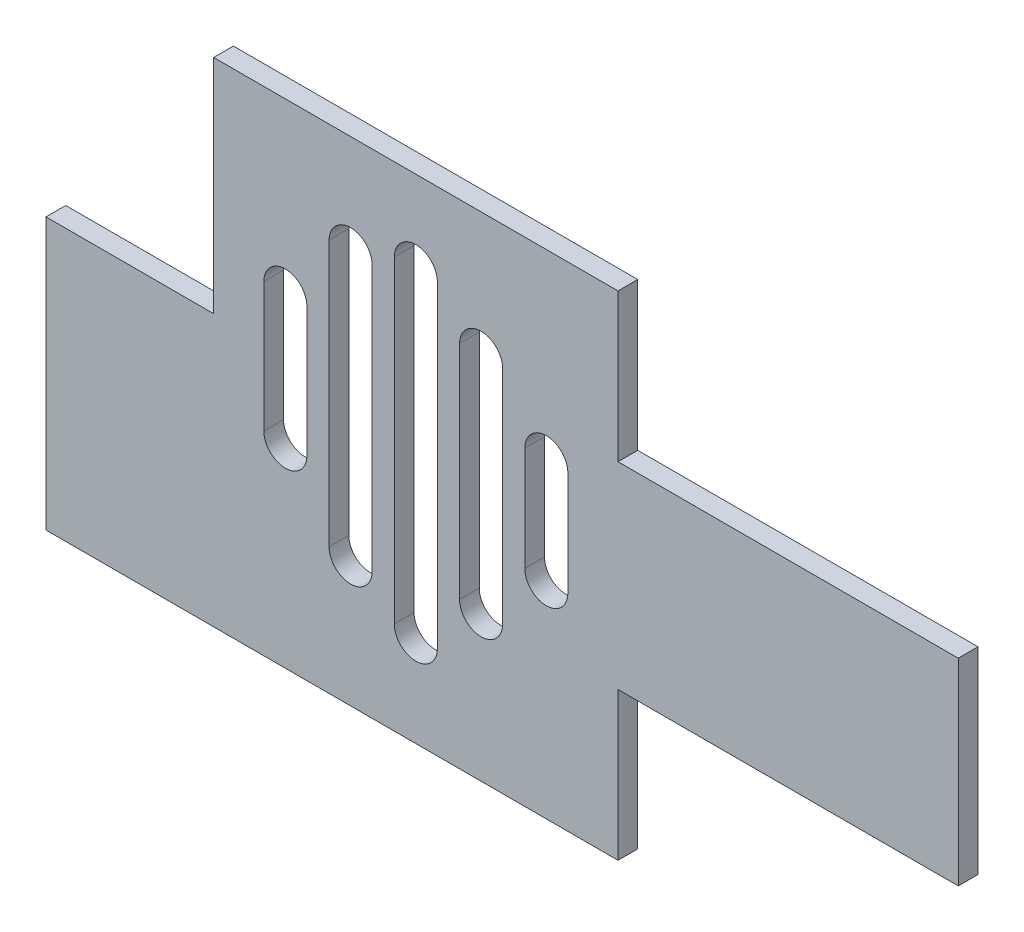
ISO-10303-21;
HEADER;
FILE_DESCRIPTION(('STEP AP214'),'2;1');
FILE_NAME('part.step','',(''),(''),'','','');
FILE_SCHEMA(('AUTOMOTIVE_DESIGN { 1 0 10303 214 1 1 1 1 }'));
ENDSEC;
DATA;
#1=APPLICATION_CONTEXT('core data for automotive mechanical design processes');
#2=APPLICATION_PROTOCOL_DEFINITION('international standard','automotive_design',2000,#1);
#3=PRODUCT_CONTEXT('',#1,'mechanical');
#4=PRODUCT('Part','Part','',(#3));
#5=PRODUCT_RELATED_PRODUCT_CATEGORY('part','',(#4));
#6=PRODUCT_DEFINITION_FORMATION('','',#4);
#7=PRODUCT_DEFINITION_CONTEXT('part definition',#1,'design');
#8=PRODUCT_DEFINITION('design','',#6,#7);
#9=PRODUCT_DEFINITION_SHAPE('','',#8);
#10=(LENGTH_UNIT() NAMED_UNIT(*) SI_UNIT(.MILLI.,.METRE.));
#11=(NAMED_UNIT(*) PLANE_ANGLE_UNIT() SI_UNIT($,.RADIAN.));
#12=(NAMED_UNIT(*) SI_UNIT($,.STERADIAN.) SOLID_ANGLE_UNIT());
#13=UNCERTAINTY_MEASURE_WITH_UNIT(LENGTH_MEASURE(1.E-05),#10,'distance_accuracy_value','');
#14=(GEOMETRIC_REPRESENTATION_CONTEXT(3) GLOBAL_UNCERTAINTY_ASSIGNED_CONTEXT((#13)) GLOBAL_UNIT_ASSIGNED_CONTEXT((#10,
#11,#12)) REPRESENTATION_CONTEXT('',''));
#15=CARTESIAN_POINT('',(0.,0.,0.));
#16=DIRECTION('',(0.,0.,1.));
#17=DIRECTION('',(1.,0.,0.));
#18=AXIS2_PLACEMENT_3D('',#15,#16,#17);
#19=CARTESIAN_POINT('',(0.,0.,4.));
#20=DIRECTION('',(0.,0.,1.));
#21=DIRECTION('',(1.,0.,0.));
#22=AXIS2_PLACEMENT_3D('',#19,#20,#21);
#23=PLANE('',#22);
#24=DIRECTION('',(1.,0.,0.));
#25=VECTOR('',#24,1.);
#26=CARTESIAN_POINT('',(41.,-50.,4.));
#27=LINE('',#26,#25);
#28=CARTESIAN_POINT('',(-75.,-50.,4.));
#29=VERTEX_POINT('',#28);
#30=CARTESIAN_POINT('',(41.,-50.,4.));
#31=VERTEX_POINT('',#30);
#32=EDGE_CURVE('E390',#29,#31,#27,.T.);
#33=ORIENTED_EDGE('',*,*,#32,.T.);
#34=DIRECTION('',(0.,1.,0.));
#35=VECTOR('',#34,1.);
#36=CARTESIAN_POINT('',(41.,-20.,4.));
#37=LINE('',#36,#35);
#38=CARTESIAN_POINT('',(41.,-20.,4.));
#39=VERTEX_POINT('',#38);
#40=EDGE_CURVE('E393',#31,#39,#37,.T.);
#41=ORIENTED_EDGE('',*,*,#40,.T.);
#42=DIRECTION('',(1.,0.,0.));
#43=VECTOR('',#42,1.);
#44=CARTESIAN_POINT('',(110.,-20.,4.));
#45=LINE('',#44,#43);
#46=CARTESIAN_POINT('',(110.,-20.,4.));
#47=VERTEX_POINT('',#46);
#48=EDGE_CURVE('E396',#39,#47,#45,.T.);
#49=ORIENTED_EDGE('',*,*,#48,.T.);
#50=DIRECTION('',(0.,1.,0.));
#51=VECTOR('',#50,1.);
#52=CARTESIAN_POINT('',(110.,20.,4.));
#53=LINE('',#52,#51);
#54=CARTESIAN_POINT('',(110.,20.,4.));
#55=VERTEX_POINT('',#54);
#56=EDGE_CURVE('E398',#47,#55,#53,.T.);
#57=ORIENTED_EDGE('',*,*,#56,.T.);
#58=DIRECTION('',(-1.,0.,0.));
#59=VECTOR('',#58,1.);
#60=CARTESIAN_POINT('',(41.,20.,4.));
#61=LINE('',#60,#59);
#62=CARTESIAN_POINT('',(41.,20.,4.));
#63=VERTEX_POINT('',#62);
#64=EDGE_CURVE('E400',#55,#63,#61,.T.);
#65=ORIENTED_EDGE('',*,*,#64,.T.);
#66=DIRECTION('',(0.,1.,0.));
#67=VECTOR('',#66,1.);
#68=CARTESIAN_POINT('',(41.,50.,4.));
#69=LINE('',#68,#67);
#70=CARTESIAN_POINT('',(41.,50.,4.));
#71=VERTEX_POINT('',#70);
#72=EDGE_CURVE('E402',#63,#71,#69,.T.);
#73=ORIENTED_EDGE('',*,*,#72,.T.);
#74=DIRECTION('',(-1.,0.,0.));
#75=VECTOR('',#74,1.);
#76=CARTESIAN_POINT('',(41.,50.,4.));
#77=LINE('',#76,#75);
#78=CARTESIAN_POINT('',(-41.,50.,4.));
#79=VERTEX_POINT('',#78);
#80=EDGE_CURVE('E404',#71,#79,#77,.T.);
#81=ORIENTED_EDGE('',*,*,#80,.T.);
#82=DIRECTION('',(0.,-1.,0.));
#83=VECTOR('',#82,1.);
#84=CARTESIAN_POINT('',(-41.,50.,4.));
#85=LINE('',#84,#83);
#86=CARTESIAN_POINT('',(-41.,4.99999999999999,4.));
#87=VERTEX_POINT('',#86);
#88=EDGE_CURVE('E406',#79,#87,#85,.T.);
#89=ORIENTED_EDGE('',*,*,#88,.T.);
#90=DIRECTION('',(-1.,0.,0.));
#91=VECTOR('',#90,1.);
#92=CARTESIAN_POINT('',(-41.,4.99999999999999,4.));
#93=LINE('',#92,#91);
#94=CARTESIAN_POINT('',(-75.,4.99999999999998,4.));
#95=VERTEX_POINT('',#94);
#96=EDGE_CURVE('E408',#87,#95,#93,.T.);
#97=ORIENTED_EDGE('',*,*,#96,.T.);
#98=DIRECTION('',(0.,-1.,0.));
#99=VECTOR('',#98,1.);
#100=CARTESIAN_POINT('',(-75.,4.99999999999998,4.));
#101=LINE('',#100,#99);
#102=EDGE_CURVE('E410',#95,#29,#101,.T.);
#103=ORIENTED_EDGE('',*,*,#102,.T.);
#104=EDGE_LOOP('',(#33,#41,#49,#57,#65,#73,#81,#89,#97,#103));
#105=FACE_BOUND('',#104,.T.);
#106=DIRECTION('',(0.,-1.,0.));
#107=VECTOR('',#106,1.);
#108=CARTESIAN_POINT('',(-4.36484114330157,33.2683363309352,4.));
#109=LINE('',#108,#107);
#110=CARTESIAN_POINT('',(-4.36484114330157,33.2683363309352,4.));
#111=VERTEX_POINT('',#110);
#112=CARTESIAN_POINT('',(-4.36484114330157,-31.1611600719424,4.));
#113=VERTEX_POINT('',#112);
#114=EDGE_CURVE('E361',#111,#113,#109,.T.);
#115=ORIENTED_EDGE('',*,*,#114,.F.);
#116=CARTESIAN_POINT('',(0.,33.2683363309352,4.));
#117=DIRECTION('',(0.,0.,1.));
#118=DIRECTION('',(1.,0.,0.));
#119=AXIS2_PLACEMENT_3D('',#116,#117,#118);
#120=CIRCLE('',#119,4.36484114330157);
#121=CARTESIAN_POINT('',(4.36484114330157,33.2683363309352,4.));
#122=VERTEX_POINT('',#121);
#123=EDGE_CURVE('E359',#122,#111,#120,.T.);
#124=ORIENTED_EDGE('',*,*,#123,.F.);
#125=DIRECTION('',(0.,1.,0.));
#126=VECTOR('',#125,1.);
#127=CARTESIAN_POINT('',(4.36484114330157,33.2683363309352,4.));
#128=LINE('',#127,#126);
#129=CARTESIAN_POINT('',(4.36484114330157,-31.1611600719424,4.));
#130=VERTEX_POINT('',#129);
#131=EDGE_CURVE('E367',#130,#122,#128,.T.);
#132=ORIENTED_EDGE('',*,*,#131,.F.);
#133=CARTESIAN_POINT('',(0.,-31.1611600719424,4.));
#134=DIRECTION('',(0.,0.,1.));
#135=DIRECTION('',(1.,0.,0.));
#136=AXIS2_PLACEMENT_3D('',#133,#134,#135);
#137=CIRCLE('',#136,4.36484114330157);
#138=EDGE_CURVE('E364',#113,#130,#137,.T.);
#139=ORIENTED_EDGE('',*,*,#138,.F.);
#140=EDGE_LOOP('',(#115,#124,#132,#139));
#141=FACE_BOUND('',#140,.T.);
#142=DIRECTION('',(0.,-1.,0.));
#143=VECTOR('',#142,1.);
#144=CARTESIAN_POINT('',(-17.5945234233016,29.6338519184652,4.));
#145=LINE('',#144,#143);
#146=CARTESIAN_POINT('',(-17.5945234233016,29.6338519184652,4.));
#147=VERTEX_POINT('',#146);
#148=CARTESIAN_POINT('',(-17.5945234233016,-24.2225989208633,4.));
#149=VERTEX_POINT('',#148);
#150=EDGE_CURVE('E330',#147,#149,#145,.T.);
#151=ORIENTED_EDGE('',*,*,#150,.F.);
#152=CARTESIAN_POINT('',(-13.2296822833016,29.6338519184652,4.));
#153=DIRECTION('',(0.,0.,1.));
#154=DIRECTION('',(1.,0.,0.));
#155=AXIS2_PLACEMENT_3D('',#152,#153,#154);
#156=CIRCLE('',#155,4.36484114);
#157=CARTESIAN_POINT('',(-8.86484114330157,29.6338519184652,4.));
#158=VERTEX_POINT('',#157);
#159=EDGE_CURVE('E328',#158,#147,#156,.T.);
#160=ORIENTED_EDGE('',*,*,#159,.F.);
#161=DIRECTION('',(0.,1.,0.));
#162=VECTOR('',#161,1.);
#163=CARTESIAN_POINT('',(-8.86484114330157,29.6338519184652,4.));
#164=LINE('',#163,#162);
#165=CARTESIAN_POINT('',(-8.86484114330157,-24.2225989208633,4.));
#166=VERTEX_POINT('',#165);
#167=EDGE_CURVE('E336',#166,#158,#164,.T.);
#168=ORIENTED_EDGE('',*,*,#167,.F.);
#169=CARTESIAN_POINT('',(-13.2296822833016,-24.2225989208633,4.));
#170=DIRECTION('',(0.,0.,1.));
#171=DIRECTION('',(1.,0.,0.));
#172=AXIS2_PLACEMENT_3D('',#169,#170,#171);
#173=CIRCLE('',#172,4.36484114);
#174=EDGE_CURVE('E333',#149,#166,#173,.T.);
#175=ORIENTED_EDGE('',*,*,#174,.F.);
#176=EDGE_LOOP('',(#151,#160,#168,#175));
#177=FACE_BOUND('',#176,.T.);
#178=DIRECTION('',(0.,-1.,0.));
#179=VECTOR('',#178,1.);
#180=CARTESIAN_POINT('',(8.86484114330157,24.6777368105516,4.));
#181=LINE('',#180,#179);
#182=CARTESIAN_POINT('',(8.86484114330157,24.6777368105516,4.));
#183=VERTEX_POINT('',#182);
#184=CARTESIAN_POINT('',(8.86484114330157,-20.2577068345324,4.));
#185=VERTEX_POINT('',#184);
#186=EDGE_CURVE('E299',#183,#185,#181,.T.);
#187=ORIENTED_EDGE('',*,*,#186,.F.);
#188=CARTESIAN_POINT('',(13.2296822833016,24.6777368105516,4.));
#189=DIRECTION('',(0.,0.,1.));
#190=DIRECTION('',(1.,0.,0.));
#191=AXIS2_PLACEMENT_3D('',#188,#189,#190);
#192=CIRCLE('',#191,4.36484114);
#193=CARTESIAN_POINT('',(17.5945234233016,24.6777368105516,4.));
#194=VERTEX_POINT('',#193);
#195=EDGE_CURVE('E297',#194,#183,#192,.T.);
#196=ORIENTED_EDGE('',*,*,#195,.F.);
#197=DIRECTION('',(0.,1.,0.));
#198=VECTOR('',#197,1.);
#199=CARTESIAN_POINT('',(17.5945234233016,24.6777368105516,4.));
#200=LINE('',#199,#198);
#201=CARTESIAN_POINT('',(17.5945234233016,-20.2577068345324,4.));
#202=VERTEX_POINT('',#201);
#203=EDGE_CURVE('E305',#202,#194,#200,.T.);
#204=ORIENTED_EDGE('',*,*,#203,.F.);
#205=CARTESIAN_POINT('',(13.2296822833016,-20.2577068345324,4.));
#206=DIRECTION('',(0.,0.,1.));
#207=DIRECTION('',(1.,0.,0.));
#208=AXIS2_PLACEMENT_3D('',#205,#206,#207);
#209=CIRCLE('',#208,4.36484114);
#210=EDGE_CURVE('E302',#185,#202,#209,.T.);
#211=ORIENTED_EDGE('',*,*,#210,.F.);
#212=EDGE_LOOP('',(#187,#196,#204,#211));
#213=FACE_BOUND('',#212,.T.);
#214=DIRECTION('',(0.,-1.,0.));
#215=VECTOR('',#214,1.);
#216=CARTESIAN_POINT('',(-30.8242057033016,15.756729616307,4.));
#217=LINE('',#216,#215);
#218=CARTESIAN_POINT('',(-30.8242057033016,15.756729616307,4.));
#219=VERTEX_POINT('',#218);
#220=CARTESIAN_POINT('',(-30.8242057033016,-10.5106804556355,4.));
#221=VERTEX_POINT('',#220);
#222=EDGE_CURVE('E268',#219,#221,#217,.T.);
#223=ORIENTED_EDGE('',*,*,#222,.F.);
#224=CARTESIAN_POINT('',(-26.4593645633016,15.756729616307,4.));
#225=DIRECTION('',(0.,0.,1.));
#226=DIRECTION('',(1.,0.,0.));
#227=AXIS2_PLACEMENT_3D('',#224,#225,#226);
#228=CIRCLE('',#227,4.36484114);
#229=CARTESIAN_POINT('',(-22.0945234233016,15.756729616307,4.));
#230=VERTEX_POINT('',#229);
#231=EDGE_CURVE('E266',#230,#219,#228,.T.);
#232=ORIENTED_EDGE('',*,*,#231,.F.);
#233=DIRECTION('',(0.,1.,0.));
#234=VECTOR('',#233,1.);
#235=CARTESIAN_POINT('',(-22.0945234233016,15.756729616307,4.));
#236=LINE('',#235,#234);
#237=CARTESIAN_POINT('',(-22.0945234233016,-10.5106804556355,4.));
#238=VERTEX_POINT('',#237);
#239=EDGE_CURVE('E274',#238,#230,#236,.T.);
#240=ORIENTED_EDGE('',*,*,#239,.F.);
#241=CARTESIAN_POINT('',(-26.4593645633016,-10.5106804556355,4.));
#242=DIRECTION('',(0.,0.,1.));
#243=DIRECTION('',(1.,0.,0.));
#244=AXIS2_PLACEMENT_3D('',#241,#242,#243);
#245=CIRCLE('',#244,4.36484114);
#246=EDGE_CURVE('E271',#221,#238,#245,.T.);
#247=ORIENTED_EDGE('',*,*,#246,.F.);
#248=EDGE_LOOP('',(#223,#232,#240,#247));
#249=FACE_BOUND('',#248,.T.);
#250=DIRECTION('',(0.,-1.,0.));
#251=VECTOR('',#250,1.);
#252=CARTESIAN_POINT('',(22.0945234233016,12.9482643884892,4.));
#253=LINE('',#252,#251);
#254=CARTESIAN_POINT('',(22.0945234233016,12.9482643884892,4.));
#255=VERTEX_POINT('',#254);
#256=CARTESIAN_POINT('',(22.0945234233016,-8.19782673860911,4.));
#257=VERTEX_POINT('',#256);
#258=EDGE_CURVE('E238',#255,#257,#253,.T.);
#259=ORIENTED_EDGE('',*,*,#258,.F.);
#260=CARTESIAN_POINT('',(26.4593645633016,12.9482643884892,4.));
#261=DIRECTION('',(0.,0.,1.));
#262=DIRECTION('',(1.,0.,0.));
#263=AXIS2_PLACEMENT_3D('',#260,#261,#262);
#264=CIRCLE('',#263,4.36484114);
#265=CARTESIAN_POINT('',(30.8242057033016,12.9482643884892,4.));
#266=VERTEX_POINT('',#265);
#267=EDGE_CURVE('E230',#266,#255,#264,.T.);
#268=ORIENTED_EDGE('',*,*,#267,.F.);
#269=DIRECTION('',(0.,1.,0.));
#270=VECTOR('',#269,1.);
#271=CARTESIAN_POINT('',(30.8242057033016,12.9482643884892,4.));
#272=LINE('',#271,#270);
#273=CARTESIAN_POINT('',(30.8242057033016,-8.19782673860911,4.));
#274=VERTEX_POINT('',#273);
#275=EDGE_CURVE('E252',#274,#266,#272,.T.);
#276=ORIENTED_EDGE('',*,*,#275,.F.);
#277=CARTESIAN_POINT('',(26.4593645633016,-8.19782673860911,4.));
#278=DIRECTION('',(0.,0.,1.));
#279=DIRECTION('',(1.,0.,0.));
#280=AXIS2_PLACEMENT_3D('',#277,#278,#279);
#281=CIRCLE('',#280,4.36484114);
#282=EDGE_CURVE('E250',#257,#274,#281,.T.);
#283=ORIENTED_EDGE('',*,*,#282,.F.);
#284=EDGE_LOOP('',(#259,#268,#276,#283));
#285=FACE_BOUND('',#284,.T.);
#286=ADVANCED_FACE('F33',(#105,#141,#177,#213,#249,#285),#23,.T.);
#287=CARTESIAN_POINT('',(0.,0.,0.));
#288=DIRECTION('',(0.,0.,1.));
#289=DIRECTION('',(1.,0.,0.));
#290=AXIS2_PLACEMENT_3D('',#287,#288,#289);
#291=PLANE('',#290);
#292=CARTESIAN_POINT('',(-26.4593645633016,15.756729616307,0.));
#293=DIRECTION('',(0.,0.,1.));
#294=DIRECTION('',(1.,0.,0.));
#295=AXIS2_PLACEMENT_3D('',#292,#293,#294);
#296=CIRCLE('',#295,4.36484114);
#297=CARTESIAN_POINT('',(-22.0945234233016,15.756729616307,0.));
#298=VERTEX_POINT('',#297);
#299=CARTESIAN_POINT('',(-30.8242057033016,15.756729616307,0.));
#300=VERTEX_POINT('',#299);
#301=EDGE_CURVE('E246',#298,#300,#296,.T.);
#302=ORIENTED_EDGE('',*,*,#301,.T.);
#303=DIRECTION('',(0.,-1.,0.));
#304=VECTOR('',#303,1.);
#305=CARTESIAN_POINT('',(-30.8242057033016,15.756729616307,0.));
#306=LINE('',#305,#304);
#307=CARTESIAN_POINT('',(-30.8242057033016,-10.5106804556355,0.));
#308=VERTEX_POINT('',#307);
#309=EDGE_CURVE('E279',#300,#308,#306,.T.);
#310=ORIENTED_EDGE('',*,*,#309,.T.);
#311=CARTESIAN_POINT('',(-26.4593645633016,-10.5106804556355,0.));
#312=DIRECTION('',(0.,0.,1.));
#313=DIRECTION('',(1.,0.,0.));
#314=AXIS2_PLACEMENT_3D('',#311,#312,#313);
#315=CIRCLE('',#314,4.36484114);
#316=CARTESIAN_POINT('',(-22.0945234233016,-10.5106804556355,0.));
#317=VERTEX_POINT('',#316);
#318=EDGE_CURVE('E282',#308,#317,#315,.T.);
#319=ORIENTED_EDGE('',*,*,#318,.T.);
#320=DIRECTION('',(0.,1.,0.));
#321=VECTOR('',#320,1.);
#322=CARTESIAN_POINT('',(-22.0945234233016,15.756729616307,0.));
#323=LINE('',#322,#321);
#324=EDGE_CURVE('E269',#317,#298,#323,.T.);
#325=ORIENTED_EDGE('',*,*,#324,.T.);
#326=EDGE_LOOP('',(#302,#310,#319,#325));
#327=FACE_BOUND('',#326,.T.);
#328=CARTESIAN_POINT('',(-13.2296822833016,29.6338519184652,0.));
#329=DIRECTION('',(0.,0.,1.));
#330=DIRECTION('',(1.,0.,0.));
#331=AXIS2_PLACEMENT_3D('',#328,#329,#330);
#332=CIRCLE('',#331,4.36484114);
#333=CARTESIAN_POINT('',(-8.86484114330157,29.6338519184652,0.));
#334=VERTEX_POINT('',#333);
#335=CARTESIAN_POINT('',(-17.5945234233016,29.6338519184652,0.));
#336=VERTEX_POINT('',#335);
#337=EDGE_CURVE('E327',#334,#336,#332,.T.);
#338=ORIENTED_EDGE('',*,*,#337,.T.);
#339=DIRECTION('',(0.,-1.,0.));
#340=VECTOR('',#339,1.);
#341=CARTESIAN_POINT('',(-17.5945234233016,29.6338519184652,0.));
#342=LINE('',#341,#340);
#343=CARTESIAN_POINT('',(-17.5945234233016,-24.2225989208633,0.));
#344=VERTEX_POINT('',#343);
#345=EDGE_CURVE('E341',#336,#344,#342,.T.);
#346=ORIENTED_EDGE('',*,*,#345,.T.);
#347=CARTESIAN_POINT('',(-13.2296822833016,-24.2225989208633,0.));
#348=DIRECTION('',(0.,0.,1.));
#349=DIRECTION('',(1.,0.,0.));
#350=AXIS2_PLACEMENT_3D('',#347,#348,#349);
#351=CIRCLE('',#350,4.36484114);
#352=CARTESIAN_POINT('',(-8.86484114330157,-24.2225989208633,0.));
#353=VERTEX_POINT('',#352);
#354=EDGE_CURVE('E344',#344,#353,#351,.T.);
#355=ORIENTED_EDGE('',*,*,#354,.T.);
#356=DIRECTION('',(0.,1.,0.));
#357=VECTOR('',#356,1.);
#358=CARTESIAN_POINT('',(-8.86484114330157,29.6338519184652,0.));
#359=LINE('',#358,#357);
#360=EDGE_CURVE('E331',#353,#334,#359,.T.);
#361=ORIENTED_EDGE('',*,*,#360,.T.);
#362=EDGE_LOOP('',(#338,#346,#355,#361));
#363=FACE_BOUND('',#362,.T.);
#364=DIRECTION('',(1.,0.,0.));
#365=VECTOR('',#364,1.);
#366=CARTESIAN_POINT('',(41.,-50.,0.));
#367=LINE('',#366,#365);
#368=CARTESIAN_POINT('',(-75.,-50.,0.));
#369=VERTEX_POINT('',#368);
#370=CARTESIAN_POINT('',(41.,-50.,0.));
#371=VERTEX_POINT('',#370);
#372=EDGE_CURVE('E389',#369,#371,#367,.T.);
#373=ORIENTED_EDGE('',*,*,#372,.F.);
#374=DIRECTION('',(0.,-1.,0.));
#375=VECTOR('',#374,1.);
#376=CARTESIAN_POINT('',(-75.,4.99999999999998,0.));
#377=LINE('',#376,#375);
#378=CARTESIAN_POINT('',(-75.,4.99999999999998,0.));
#379=VERTEX_POINT('',#378);
#380=EDGE_CURVE('E394',#379,#369,#377,.T.);
#381=ORIENTED_EDGE('',*,*,#380,.F.);
#382=DIRECTION('',(-1.,0.,0.));
#383=VECTOR('',#382,1.);
#384=CARTESIAN_POINT('',(-41.,4.99999999999999,0.));
#385=LINE('',#384,#383);
#386=CARTESIAN_POINT('',(-41.,4.99999999999999,0.));
#387=VERTEX_POINT('',#386);
#388=EDGE_CURVE('E429',#387,#379,#385,.T.);
#389=ORIENTED_EDGE('',*,*,#388,.F.);
#390=DIRECTION('',(0.,-1.,0.));
#391=VECTOR('',#390,1.);
#392=CARTESIAN_POINT('',(-41.,50.,0.));
#393=LINE('',#392,#391);
#394=CARTESIAN_POINT('',(-41.,50.,0.));
#395=VERTEX_POINT('',#394);
#396=EDGE_CURVE('E427',#395,#387,#393,.T.);
#397=ORIENTED_EDGE('',*,*,#396,.F.);
#398=DIRECTION('',(-1.,0.,0.));
#399=VECTOR('',#398,1.);
#400=CARTESIAN_POINT('',(41.,50.,0.));
#401=LINE('',#400,#399);
#402=CARTESIAN_POINT('',(41.,50.,0.));
#403=VERTEX_POINT('',#402);
#404=EDGE_CURVE('E425',#403,#395,#401,.T.);
#405=ORIENTED_EDGE('',*,*,#404,.F.);
#406=DIRECTION('',(0.,1.,0.));
#407=VECTOR('',#406,1.);
#408=CARTESIAN_POINT('',(41.,50.,0.));
#409=LINE('',#408,#407);
#410=CARTESIAN_POINT('',(41.,20.,0.));
#411=VERTEX_POINT('',#410);
#412=EDGE_CURVE('E423',#411,#403,#409,.T.);
#413=ORIENTED_EDGE('',*,*,#412,.F.);
#414=DIRECTION('',(-1.,0.,0.));
#415=VECTOR('',#414,1.);
#416=CARTESIAN_POINT('',(41.,20.,0.));
#417=LINE('',#416,#415);
#418=CARTESIAN_POINT('',(110.,20.,0.));
#419=VERTEX_POINT('',#418);
#420=EDGE_CURVE('E421',#419,#411,#417,.T.);
#421=ORIENTED_EDGE('',*,*,#420,.F.);
#422=DIRECTION('',(0.,1.,0.));
#423=VECTOR('',#422,1.);
#424=CARTESIAN_POINT('',(110.,20.,0.));
#425=LINE('',#424,#423);
#426=CARTESIAN_POINT('',(110.,-20.,0.));
#427=VERTEX_POINT('',#426);
#428=EDGE_CURVE('E419',#427,#419,#425,.T.);
#429=ORIENTED_EDGE('',*,*,#428,.F.);
#430=DIRECTION('',(1.,0.,0.));
#431=VECTOR('',#430,1.);
#432=CARTESIAN_POINT('',(110.,-20.,0.));
#433=LINE('',#432,#431);
#434=CARTESIAN_POINT('',(41.,-20.,0.));
#435=VERTEX_POINT('',#434);
#436=EDGE_CURVE('E417',#435,#427,#433,.T.);
#437=ORIENTED_EDGE('',*,*,#436,.F.);
#438=DIRECTION('',(0.,1.,0.));
#439=VECTOR('',#438,1.);
#440=CARTESIAN_POINT('',(41.,-20.,0.));
#441=LINE('',#440,#439);
#442=EDGE_CURVE('E415',#371,#435,#441,.T.);
#443=ORIENTED_EDGE('',*,*,#442,.F.);
#444=EDGE_LOOP('',(#373,#381,#389,#397,#405,#413,#421,#429,#437,#443));
#445=FACE_BOUND('',#444,.T.);
#446=CARTESIAN_POINT('',(0.,33.2683363309352,0.));
#447=DIRECTION('',(0.,0.,1.));
#448=DIRECTION('',(1.,0.,0.));
#449=AXIS2_PLACEMENT_3D('',#446,#447,#448);
#450=CIRCLE('',#449,4.36484114330157);
#451=CARTESIAN_POINT('',(4.36484114330157,33.2683363309352,0.));
#452=VERTEX_POINT('',#451);
#453=CARTESIAN_POINT('',(-4.36484114330157,33.2683363309352,0.));
#454=VERTEX_POINT('',#453);
#455=EDGE_CURVE('E358',#452,#454,#450,.T.);
#456=ORIENTED_EDGE('',*,*,#455,.T.);
#457=DIRECTION('',(0.,-1.,0.));
#458=VECTOR('',#457,1.);
#459=CARTESIAN_POINT('',(-4.36484114330157,33.2683363309352,0.));
#460=LINE('',#459,#458);
#461=CARTESIAN_POINT('',(-4.36484114330157,-31.1611600719424,0.));
#462=VERTEX_POINT('',#461);
#463=EDGE_CURVE('E372',#454,#462,#460,.T.);
#464=ORIENTED_EDGE('',*,*,#463,.T.);
#465=CARTESIAN_POINT('',(0.,-31.1611600719424,0.));
#466=DIRECTION('',(0.,0.,1.));
#467=DIRECTION('',(1.,0.,0.));
#468=AXIS2_PLACEMENT_3D('',#465,#466,#467);
#469=CIRCLE('',#468,4.36484114330157);
#470=CARTESIAN_POINT('',(4.36484114330157,-31.1611600719424,0.));
#471=VERTEX_POINT('',#470);
#472=EDGE_CURVE('E375',#462,#471,#469,.T.);
#473=ORIENTED_EDGE('',*,*,#472,.T.);
#474=DIRECTION('',(0.,1.,0.));
#475=VECTOR('',#474,1.);
#476=CARTESIAN_POINT('',(4.36484114330157,33.2683363309352,0.));
#477=LINE('',#476,#475);
#478=EDGE_CURVE('E362',#471,#452,#477,.T.);
#479=ORIENTED_EDGE('',*,*,#478,.T.);
#480=EDGE_LOOP('',(#456,#464,#473,#479));
#481=FACE_BOUND('',#480,.T.);
#482=CARTESIAN_POINT('',(13.2296822833016,24.6777368105516,0.));
#483=DIRECTION('',(0.,0.,1.));
#484=DIRECTION('',(1.,0.,0.));
#485=AXIS2_PLACEMENT_3D('',#482,#483,#484);
#486=CIRCLE('',#485,4.36484114);
#487=CARTESIAN_POINT('',(17.5945234233016,24.6777368105516,0.));
#488=VERTEX_POINT('',#487);
#489=CARTESIAN_POINT('',(8.86484114330157,24.6777368105516,0.));
#490=VERTEX_POINT('',#489);
#491=EDGE_CURVE('E296',#488,#490,#486,.T.);
#492=ORIENTED_EDGE('',*,*,#491,.T.);
#493=DIRECTION('',(0.,-1.,0.));
#494=VECTOR('',#493,1.);
#495=CARTESIAN_POINT('',(8.86484114330157,24.6777368105516,0.));
#496=LINE('',#495,#494);
#497=CARTESIAN_POINT('',(8.86484114330157,-20.2577068345324,0.));
#498=VERTEX_POINT('',#497);
#499=EDGE_CURVE('E310',#490,#498,#496,.T.);
#500=ORIENTED_EDGE('',*,*,#499,.T.);
#501=CARTESIAN_POINT('',(13.2296822833016,-20.2577068345324,0.));
#502=DIRECTION('',(0.,0.,1.));
#503=DIRECTION('',(1.,0.,0.));
#504=AXIS2_PLACEMENT_3D('',#501,#502,#503);
#505=CIRCLE('',#504,4.36484114);
#506=CARTESIAN_POINT('',(17.5945234233016,-20.2577068345324,0.));
#507=VERTEX_POINT('',#506);
#508=EDGE_CURVE('E313',#498,#507,#505,.T.);
#509=ORIENTED_EDGE('',*,*,#508,.T.);
#510=DIRECTION('',(0.,1.,0.));
#511=VECTOR('',#510,1.);
#512=CARTESIAN_POINT('',(17.5945234233016,24.6777368105516,0.));
#513=LINE('',#512,#511);
#514=EDGE_CURVE('E300',#507,#488,#513,.T.);
#515=ORIENTED_EDGE('',*,*,#514,.T.);
#516=EDGE_LOOP('',(#492,#500,#509,#515));
#517=FACE_BOUND('',#516,.T.);
#518=CARTESIAN_POINT('',(26.4593645633016,12.9482643884892,0.));
#519=DIRECTION('',(0.,0.,1.));
#520=DIRECTION('',(1.,0.,0.));
#521=AXIS2_PLACEMENT_3D('',#518,#519,#520);
#522=CIRCLE('',#521,4.36484114);
#523=CARTESIAN_POINT('',(30.8242057033016,12.9482643884892,0.));
#524=VERTEX_POINT('',#523);
#525=CARTESIAN_POINT('',(22.0945234233016,12.9482643884892,0.));
#526=VERTEX_POINT('',#525);
#527=EDGE_CURVE('E56',#524,#526,#522,.T.);
#528=ORIENTED_EDGE('',*,*,#527,.T.);
#529=DIRECTION('',(0.,-1.,0.));
#530=VECTOR('',#529,1.);
#531=CARTESIAN_POINT('',(22.0945234233016,12.9482643884892,0.));
#532=LINE('',#531,#530);
#533=CARTESIAN_POINT('',(22.0945234233016,-8.19782673860911,0.));
#534=VERTEX_POINT('',#533);
#535=EDGE_CURVE('E245',#526,#534,#532,.T.);
#536=ORIENTED_EDGE('',*,*,#535,.T.);
#537=CARTESIAN_POINT('',(26.4593645633016,-8.19782673860911,0.));
#538=DIRECTION('',(0.,0.,1.));
#539=DIRECTION('',(1.,0.,0.));
#540=AXIS2_PLACEMENT_3D('',#537,#538,#539);
#541=CIRCLE('',#540,4.36484114);
#542=CARTESIAN_POINT('',(30.8242057033016,-8.19782673860911,0.));
#543=VERTEX_POINT('',#542);
#544=EDGE_CURVE('E258',#534,#543,#541,.T.);
#545=ORIENTED_EDGE('',*,*,#544,.T.);
#546=DIRECTION('',(0.,1.,0.));
#547=VECTOR('',#546,1.);
#548=CARTESIAN_POINT('',(30.8242057033016,12.9482643884892,0.));
#549=LINE('',#548,#547);
#550=EDGE_CURVE('E239',#543,#524,#549,.T.);
#551=ORIENTED_EDGE('',*,*,#550,.T.);
#552=EDGE_LOOP('',(#528,#536,#545,#551));
#553=FACE_BOUND('',#552,.T.);
#554=ADVANCED_FACE('F465',(#327,#363,#445,#481,#517,#553),#291,.F.);
#555=CARTESIAN_POINT('',(41.,-50.,4.));
#556=DIRECTION('',(0.,1.,0.));
#557=DIRECTION('',(-1.,0.,0.));
#558=AXIS2_PLACEMENT_3D('',#555,#556,#557);
#559=PLANE('',#558);
#560=ORIENTED_EDGE('',*,*,#372,.T.);
#561=DIRECTION('',(0.,0.,-1.));
#562=VECTOR('',#561,1.);
#563=CARTESIAN_POINT('',(41.,-50.,4.));
#564=LINE('',#563,#562);
#565=EDGE_CURVE('E11',#31,#371,#564,.T.);
#566=ORIENTED_EDGE('',*,*,#565,.F.);
#567=ORIENTED_EDGE('',*,*,#32,.F.);
#568=DIRECTION('',(0.,0.,-1.));
#569=VECTOR('',#568,1.);
#570=CARTESIAN_POINT('',(-75.,-50.,4.));
#571=LINE('',#570,#569);
#572=EDGE_CURVE('E412',#29,#369,#571,.T.);
#573=ORIENTED_EDGE('',*,*,#572,.T.);
#574=EDGE_LOOP('',(#560,#566,#567,#573));
#575=FACE_BOUND('',#574,.T.);
#576=ADVANCED_FACE('F35',(#575),#559,.F.);
#577=CARTESIAN_POINT('',(41.,-20.,4.));
#578=DIRECTION('',(-1.,0.,0.));
#579=DIRECTION('',(0.,-1.,0.));
#580=AXIS2_PLACEMENT_3D('',#577,#578,#579);
#581=PLANE('',#580);
#582=ORIENTED_EDGE('',*,*,#442,.T.);
#583=DIRECTION('',(0.,0.,-1.));
#584=VECTOR('',#583,1.);
#585=CARTESIAN_POINT('',(41.,-20.,4.));
#586=LINE('',#585,#584);
#587=EDGE_CURVE('E41',#39,#435,#586,.T.);
#588=ORIENTED_EDGE('',*,*,#587,.F.);
#589=ORIENTED_EDGE('',*,*,#40,.F.);
#590=ORIENTED_EDGE('',*,*,#565,.T.);
#591=EDGE_LOOP('',(#582,#588,#589,#590));
#592=FACE_BOUND('',#591,.T.);
#593=ADVANCED_FACE('F483',(#592),#581,.F.);
#594=CARTESIAN_POINT('',(110.,-20.,4.));
#595=DIRECTION('',(0.,1.,0.));
#596=DIRECTION('',(-1.,0.,0.));
#597=AXIS2_PLACEMENT_3D('',#594,#595,#596);
#598=PLANE('',#597);
#599=ORIENTED_EDGE('',*,*,#436,.T.);
#600=DIRECTION('',(0.,0.,-1.));
#601=VECTOR('',#600,1.);
#602=CARTESIAN_POINT('',(110.,-20.,4.));
#603=LINE('',#602,#601);
#604=EDGE_CURVE('E452',#47,#427,#603,.T.);
#605=ORIENTED_EDGE('',*,*,#604,.F.);
#606=ORIENTED_EDGE('',*,*,#48,.F.);
#607=ORIENTED_EDGE('',*,*,#587,.T.);
#608=EDGE_LOOP('',(#599,#605,#606,#607));
#609=FACE_BOUND('',#608,.T.);
#610=ADVANCED_FACE('F459',(#609),#598,.F.);
#611=CARTESIAN_POINT('',(110.,20.,4.));
#612=DIRECTION('',(-1.,0.,0.));
#613=DIRECTION('',(0.,-1.,0.));
#614=AXIS2_PLACEMENT_3D('',#611,#612,#613);
#615=PLANE('',#614);
#616=ORIENTED_EDGE('',*,*,#428,.T.);
#617=DIRECTION('',(0.,0.,-1.));
#618=VECTOR('',#617,1.);
#619=CARTESIAN_POINT('',(110.,20.,4.));
#620=LINE('',#619,#618);
#621=EDGE_CURVE('E449',#55,#419,#620,.T.);
#622=ORIENTED_EDGE('',*,*,#621,.F.);
#623=ORIENTED_EDGE('',*,*,#56,.F.);
#624=ORIENTED_EDGE('',*,*,#604,.T.);
#625=EDGE_LOOP('',(#616,#622,#623,#624));
#626=FACE_BOUND('',#625,.T.);
#627=ADVANCED_FACE('F471',(#626),#615,.F.);
#628=CARTESIAN_POINT('',(41.,20.,4.));
#629=DIRECTION('',(0.,-1.,0.));
#630=DIRECTION('',(0.,0.,-1.));
#631=AXIS2_PLACEMENT_3D('',#628,#629,#630);
#632=PLANE('',#631);
#633=ORIENTED_EDGE('',*,*,#420,.T.);
#634=DIRECTION('',(0.,0.,-1.));
#635=VECTOR('',#634,1.);
#636=CARTESIAN_POINT('',(41.,20.,4.));
#637=LINE('',#636,#635);
#638=EDGE_CURVE('E446',#63,#411,#637,.T.);
#639=ORIENTED_EDGE('',*,*,#638,.F.);
#640=ORIENTED_EDGE('',*,*,#64,.F.);
#641=ORIENTED_EDGE('',*,*,#621,.T.);
#642=EDGE_LOOP('',(#633,#639,#640,#641));
#643=FACE_BOUND('',#642,.T.);
#644=ADVANCED_FACE('F475',(#643),#632,.F.);
#645=CARTESIAN_POINT('',(41.,50.,4.));
#646=DIRECTION('',(-1.,0.,0.));
#647=DIRECTION('',(0.,-1.,0.));
#648=AXIS2_PLACEMENT_3D('',#645,#646,#647);
#649=PLANE('',#648);
#650=ORIENTED_EDGE('',*,*,#412,.T.);
#651=DIRECTION('',(0.,0.,-1.));
#652=VECTOR('',#651,1.);
#653=CARTESIAN_POINT('',(41.,50.,4.));
#654=LINE('',#653,#652);
#655=EDGE_CURVE('E443',#71,#403,#654,.T.);
#656=ORIENTED_EDGE('',*,*,#655,.F.);
#657=ORIENTED_EDGE('',*,*,#72,.F.);
#658=ORIENTED_EDGE('',*,*,#638,.T.);
#659=EDGE_LOOP('',(#650,#656,#657,#658));
#660=FACE_BOUND('',#659,.T.);
#661=ADVANCED_FACE('F506',(#660),#649,.F.);
#662=CARTESIAN_POINT('',(41.,50.,4.));
#663=DIRECTION('',(0.,-1.,0.));
#664=DIRECTION('',(0.,0.,-1.));
#665=AXIS2_PLACEMENT_3D('',#662,#663,#664);
#666=PLANE('',#665);
#667=ORIENTED_EDGE('',*,*,#404,.T.);
#668=DIRECTION('',(0.,0.,-1.));
#669=VECTOR('',#668,1.);
#670=CARTESIAN_POINT('',(-41.,50.,4.));
#671=LINE('',#670,#669);
#672=EDGE_CURVE('E440',#79,#395,#671,.T.);
#673=ORIENTED_EDGE('',*,*,#672,.F.);
#674=ORIENTED_EDGE('',*,*,#80,.F.);
#675=ORIENTED_EDGE('',*,*,#655,.T.);
#676=EDGE_LOOP('',(#667,#673,#674,#675));
#677=FACE_BOUND('',#676,.T.);
#678=ADVANCED_FACE('F503',(#677),#666,.F.);
#679=CARTESIAN_POINT('',(-41.,50.,4.));
#680=DIRECTION('',(1.,0.,0.));
#681=DIRECTION('',(0.,1.,0.));
#682=AXIS2_PLACEMENT_3D('',#679,#680,#681);
#683=PLANE('',#682);
#684=ORIENTED_EDGE('',*,*,#396,.T.);
#685=DIRECTION('',(0.,0.,-1.));
#686=VECTOR('',#685,1.);
#687=CARTESIAN_POINT('',(-41.,4.99999999999999,4.));
#688=LINE('',#687,#686);
#689=EDGE_CURVE('E437',#87,#387,#688,.T.);
#690=ORIENTED_EDGE('',*,*,#689,.F.);
#691=ORIENTED_EDGE('',*,*,#88,.F.);
#692=ORIENTED_EDGE('',*,*,#672,.T.);
#693=EDGE_LOOP('',(#684,#690,#691,#692));
#694=FACE_BOUND('',#693,.T.);
#695=ADVANCED_FACE('F499',(#694),#683,.F.);
#696=CARTESIAN_POINT('',(-41.,4.99999999999999,4.));
#697=DIRECTION('',(0.,-1.,0.));
#698=DIRECTION('',(1.,0.,0.));
#699=AXIS2_PLACEMENT_3D('',#696,#697,#698);
#700=PLANE('',#699);
#701=ORIENTED_EDGE('',*,*,#388,.T.);
#702=DIRECTION('',(0.,0.,-1.));
#703=VECTOR('',#702,1.);
#704=CARTESIAN_POINT('',(-75.,4.99999999999998,4.));
#705=LINE('',#704,#703);
#706=EDGE_CURVE('E434',#95,#379,#705,.T.);
#707=ORIENTED_EDGE('',*,*,#706,.F.);
#708=ORIENTED_EDGE('',*,*,#96,.F.);
#709=ORIENTED_EDGE('',*,*,#689,.T.);
#710=EDGE_LOOP('',(#701,#707,#708,#709));
#711=FACE_BOUND('',#710,.T.);
#712=ADVANCED_FACE('F495',(#711),#700,.F.);
#713=CARTESIAN_POINT('',(-75.,4.99999999999998,4.));
#714=DIRECTION('',(1.,0.,0.));
#715=DIRECTION('',(0.,1.,0.));
#716=AXIS2_PLACEMENT_3D('',#713,#714,#715);
#717=PLANE('',#716);
#718=ORIENTED_EDGE('',*,*,#380,.T.);
#719=ORIENTED_EDGE('',*,*,#572,.F.);
#720=ORIENTED_EDGE('',*,*,#102,.F.);
#721=ORIENTED_EDGE('',*,*,#706,.T.);
#722=EDGE_LOOP('',(#718,#719,#720,#721));
#723=FACE_BOUND('',#722,.T.);
#724=ADVANCED_FACE('F490',(#723),#717,.F.);
#725=CARTESIAN_POINT('',(0.,33.2683363309352,4.));
#726=DIRECTION('',(0.,0.,-1.));
#727=DIRECTION('',(-1.,0.,0.));
#728=AXIS2_PLACEMENT_3D('',#725,#726,#727);
#729=CYLINDRICAL_SURFACE('',#728,4.36484114330157);
#730=ORIENTED_EDGE('',*,*,#455,.F.);
#731=DIRECTION('',(0.,0.,-1.));
#732=VECTOR('',#731,1.);
#733=CARTESIAN_POINT('',(4.36484114330157,33.2683363309352,4.));
#734=LINE('',#733,#732);
#735=EDGE_CURVE('E369',#122,#452,#734,.T.);
#736=ORIENTED_EDGE('',*,*,#735,.F.);
#737=ORIENTED_EDGE('',*,*,#123,.T.);
#738=DIRECTION('',(0.,0.,-1.));
#739=VECTOR('',#738,1.);
#740=CARTESIAN_POINT('',(-4.36484114330157,33.2683363309352,4.));
#741=LINE('',#740,#739);
#742=EDGE_CURVE('E386',#111,#454,#741,.T.);
#743=ORIENTED_EDGE('',*,*,#742,.T.);
#744=EDGE_LOOP('',(#730,#736,#737,#743));
#745=FACE_BOUND('',#744,.T.);
#746=ADVANCED_FACE('F523',(#745),#729,.F.);
#747=CARTESIAN_POINT('',(-4.36484114330157,33.2683363309352,4.));
#748=DIRECTION('',(1.,0.,0.));
#749=DIRECTION('',(0.,0.,-1.));
#750=AXIS2_PLACEMENT_3D('',#747,#748,#749);
#751=PLANE('',#750);
#752=ORIENTED_EDGE('',*,*,#463,.F.);
#753=ORIENTED_EDGE('',*,*,#742,.F.);
#754=ORIENTED_EDGE('',*,*,#114,.T.);
#755=DIRECTION('',(0.,0.,-1.));
#756=VECTOR('',#755,1.);
#757=CARTESIAN_POINT('',(-4.36484114330157,-31.1611600719424,4.));
#758=LINE('',#757,#756);
#759=EDGE_CURVE('E384',#113,#462,#758,.T.);
#760=ORIENTED_EDGE('',*,*,#759,.T.);
#761=EDGE_LOOP('',(#752,#753,#754,#760));
#762=FACE_BOUND('',#761,.T.);
#763=ADVANCED_FACE('F549',(#762),#751,.T.);
#764=CARTESIAN_POINT('',(0.,-31.1611600719424,4.));
#765=DIRECTION('',(0.,0.,-1.));
#766=DIRECTION('',(-1.,0.,0.));
#767=AXIS2_PLACEMENT_3D('',#764,#765,#766);
#768=CYLINDRICAL_SURFACE('',#767,4.36484114330157);
#769=ORIENTED_EDGE('',*,*,#472,.F.);
#770=ORIENTED_EDGE('',*,*,#759,.F.);
#771=ORIENTED_EDGE('',*,*,#138,.T.);
#772=DIRECTION('',(0.,0.,-1.));
#773=VECTOR('',#772,1.);
#774=CARTESIAN_POINT('',(4.36484114330157,-31.1611600719424,4.));
#775=LINE('',#774,#773);
#776=EDGE_CURVE('E382',#130,#471,#775,.T.);
#777=ORIENTED_EDGE('',*,*,#776,.T.);
#778=EDGE_LOOP('',(#769,#770,#771,#777));
#779=FACE_BOUND('',#778,.T.);
#780=ADVANCED_FACE('F556',(#779),#768,.F.);
#781=CARTESIAN_POINT('',(4.36484114330157,33.2683363309352,4.));
#782=DIRECTION('',(-1.,0.,0.));
#783=DIRECTION('',(0.,0.,1.));
#784=AXIS2_PLACEMENT_3D('',#781,#782,#783);
#785=PLANE('',#784);
#786=ORIENTED_EDGE('',*,*,#478,.F.);
#787=ORIENTED_EDGE('',*,*,#776,.F.);
#788=ORIENTED_EDGE('',*,*,#131,.T.);
#789=ORIENTED_EDGE('',*,*,#735,.T.);
#790=EDGE_LOOP('',(#786,#787,#788,#789));
#791=FACE_BOUND('',#790,.T.);
#792=ADVANCED_FACE('F563',(#791),#785,.T.);
#793=CARTESIAN_POINT('',(-13.2296822833016,29.6338519184652,4.));
#794=DIRECTION('',(0.,0.,-1.));
#795=DIRECTION('',(-1.,0.,0.));
#796=AXIS2_PLACEMENT_3D('',#793,#794,#795);
#797=CYLINDRICAL_SURFACE('',#796,4.36484114);
#798=ORIENTED_EDGE('',*,*,#337,.F.);
#799=DIRECTION('',(0.,0.,-1.));
#800=VECTOR('',#799,1.);
#801=CARTESIAN_POINT('',(-8.86484114330157,29.6338519184652,4.));
#802=LINE('',#801,#800);
#803=EDGE_CURVE('E338',#158,#334,#802,.T.);
#804=ORIENTED_EDGE('',*,*,#803,.F.);
#805=ORIENTED_EDGE('',*,*,#159,.T.);
#806=DIRECTION('',(0.,0.,-1.));
#807=VECTOR('',#806,1.);
#808=CARTESIAN_POINT('',(-17.5945234233016,29.6338519184652,4.));
#809=LINE('',#808,#807);
#810=EDGE_CURVE('E355',#147,#336,#809,.T.);
#811=ORIENTED_EDGE('',*,*,#810,.T.);
#812=EDGE_LOOP('',(#798,#804,#805,#811));
#813=FACE_BOUND('',#812,.T.);
#814=ADVANCED_FACE('F571',(#813),#797,.F.);
#815=CARTESIAN_POINT('',(-17.5945234233016,29.6338519184652,4.));
#816=DIRECTION('',(1.,0.,0.));
#817=DIRECTION('',(0.,1.,0.));
#818=AXIS2_PLACEMENT_3D('',#815,#816,#817);
#819=PLANE('',#818);
#820=ORIENTED_EDGE('',*,*,#345,.F.);
#821=ORIENTED_EDGE('',*,*,#810,.F.);
#822=ORIENTED_EDGE('',*,*,#150,.T.);
#823=DIRECTION('',(0.,0.,-1.));
#824=VECTOR('',#823,1.);
#825=CARTESIAN_POINT('',(-17.5945234233016,-24.2225989208633,4.));
#826=LINE('',#825,#824);
#827=EDGE_CURVE('E353',#149,#344,#826,.T.);
#828=ORIENTED_EDGE('',*,*,#827,.T.);
#829=EDGE_LOOP('',(#820,#821,#822,#828));
#830=FACE_BOUND('',#829,.T.);
#831=ADVANCED_FACE('F579',(#830),#819,.T.);
#832=CARTESIAN_POINT('',(-13.2296822833016,-24.2225989208633,4.));
#833=DIRECTION('',(0.,0.,-1.));
#834=DIRECTION('',(-1.,0.,0.));
#835=AXIS2_PLACEMENT_3D('',#832,#833,#834);
#836=CYLINDRICAL_SURFACE('',#835,4.36484114);
#837=ORIENTED_EDGE('',*,*,#354,.F.);
#838=ORIENTED_EDGE('',*,*,#827,.F.);
#839=ORIENTED_EDGE('',*,*,#174,.T.);
#840=DIRECTION('',(0.,0.,-1.));
#841=VECTOR('',#840,1.);
#842=CARTESIAN_POINT('',(-8.86484114330157,-24.2225989208633,4.));
#843=LINE('',#842,#841);
#844=EDGE_CURVE('E351',#166,#353,#843,.T.);
#845=ORIENTED_EDGE('',*,*,#844,.T.);
#846=EDGE_LOOP('',(#837,#838,#839,#845));
#847=FACE_BOUND('',#846,.T.);
#848=ADVANCED_FACE('F587',(#847),#836,.F.);
#849=CARTESIAN_POINT('',(-8.86484114330157,29.6338519184652,4.));
#850=DIRECTION('',(-1.,0.,0.));
#851=DIRECTION('',(0.,-1.,0.));
#852=AXIS2_PLACEMENT_3D('',#849,#850,#851);
#853=PLANE('',#852);
#854=ORIENTED_EDGE('',*,*,#360,.F.);
#855=ORIENTED_EDGE('',*,*,#844,.F.);
#856=ORIENTED_EDGE('',*,*,#167,.T.);
#857=ORIENTED_EDGE('',*,*,#803,.T.);
#858=EDGE_LOOP('',(#854,#855,#856,#857));
#859=FACE_BOUND('',#858,.T.);
#860=ADVANCED_FACE('F595',(#859),#853,.T.);
#861=CARTESIAN_POINT('',(13.2296822833016,24.6777368105516,4.));
#862=DIRECTION('',(0.,0.,-1.));
#863=DIRECTION('',(-1.,0.,0.));
#864=AXIS2_PLACEMENT_3D('',#861,#862,#863);
#865=CYLINDRICAL_SURFACE('',#864,4.36484114);
#866=ORIENTED_EDGE('',*,*,#491,.F.);
#867=DIRECTION('',(0.,0.,-1.));
#868=VECTOR('',#867,1.);
#869=CARTESIAN_POINT('',(17.5945234233016,24.6777368105516,4.));
#870=LINE('',#869,#868);
#871=EDGE_CURVE('E307',#194,#488,#870,.T.);
#872=ORIENTED_EDGE('',*,*,#871,.F.);
#873=ORIENTED_EDGE('',*,*,#195,.T.);
#874=DIRECTION('',(0.,0.,-1.));
#875=VECTOR('',#874,1.);
#876=CARTESIAN_POINT('',(8.86484114330157,24.6777368105516,4.));
#877=LINE('',#876,#875);
#878=EDGE_CURVE('E324',#183,#490,#877,.T.);
#879=ORIENTED_EDGE('',*,*,#878,.T.);
#880=EDGE_LOOP('',(#866,#872,#873,#879));
#881=FACE_BOUND('',#880,.T.);
#882=ADVANCED_FACE('F603',(#881),#865,.F.);
#883=CARTESIAN_POINT('',(8.86484114330157,24.6777368105516,4.));
#884=DIRECTION('',(1.,0.,0.));
#885=DIRECTION('',(0.,0.,-1.));
#886=AXIS2_PLACEMENT_3D('',#883,#884,#885);
#887=PLANE('',#886);
#888=ORIENTED_EDGE('',*,*,#499,.F.);
#889=ORIENTED_EDGE('',*,*,#878,.F.);
#890=ORIENTED_EDGE('',*,*,#186,.T.);
#891=DIRECTION('',(0.,0.,-1.));
#892=VECTOR('',#891,1.);
#893=CARTESIAN_POINT('',(8.86484114330157,-20.2577068345324,4.));
#894=LINE('',#893,#892);
#895=EDGE_CURVE('E322',#185,#498,#894,.T.);
#896=ORIENTED_EDGE('',*,*,#895,.T.);
#897=EDGE_LOOP('',(#888,#889,#890,#896));
#898=FACE_BOUND('',#897,.T.);
#899=ADVANCED_FACE('F611',(#898),#887,.T.);
#900=CARTESIAN_POINT('',(13.2296822833016,-20.2577068345324,4.));
#901=DIRECTION('',(0.,0.,-1.));
#902=DIRECTION('',(-1.,0.,0.));
#903=AXIS2_PLACEMENT_3D('',#900,#901,#902);
#904=CYLINDRICAL_SURFACE('',#903,4.36484114);
#905=ORIENTED_EDGE('',*,*,#508,.F.);
#906=ORIENTED_EDGE('',*,*,#895,.F.);
#907=ORIENTED_EDGE('',*,*,#210,.T.);
#908=DIRECTION('',(0.,0.,-1.));
#909=VECTOR('',#908,1.);
#910=CARTESIAN_POINT('',(17.5945234233016,-20.2577068345324,4.));
#911=LINE('',#910,#909);
#912=EDGE_CURVE('E320',#202,#507,#911,.T.);
#913=ORIENTED_EDGE('',*,*,#912,.T.);
#914=EDGE_LOOP('',(#905,#906,#907,#913));
#915=FACE_BOUND('',#914,.T.);
#916=ADVANCED_FACE('F619',(#915),#904,.F.);
#917=CARTESIAN_POINT('',(17.5945234233016,24.6777368105516,4.));
#918=DIRECTION('',(-1.,0.,0.));
#919=DIRECTION('',(0.,-1.,0.));
#920=AXIS2_PLACEMENT_3D('',#917,#918,#919);
#921=PLANE('',#920);
#922=ORIENTED_EDGE('',*,*,#514,.F.);
#923=ORIENTED_EDGE('',*,*,#912,.F.);
#924=ORIENTED_EDGE('',*,*,#203,.T.);
#925=ORIENTED_EDGE('',*,*,#871,.T.);
#926=EDGE_LOOP('',(#922,#923,#924,#925));
#927=FACE_BOUND('',#926,.T.);
#928=ADVANCED_FACE('F627',(#927),#921,.T.);
#929=CARTESIAN_POINT('',(-26.4593645633016,15.756729616307,4.));
#930=DIRECTION('',(0.,0.,-1.));
#931=DIRECTION('',(-1.,0.,0.));
#932=AXIS2_PLACEMENT_3D('',#929,#930,#931);
#933=CYLINDRICAL_SURFACE('',#932,4.36484114);
#934=ORIENTED_EDGE('',*,*,#301,.F.);
#935=DIRECTION('',(0.,0.,-1.));
#936=VECTOR('',#935,1.);
#937=CARTESIAN_POINT('',(-22.0945234233016,15.756729616307,4.));
#938=LINE('',#937,#936);
#939=EDGE_CURVE('E276',#230,#298,#938,.T.);
#940=ORIENTED_EDGE('',*,*,#939,.F.);
#941=ORIENTED_EDGE('',*,*,#231,.T.);
#942=DIRECTION('',(0.,0.,-1.));
#943=VECTOR('',#942,1.);
#944=CARTESIAN_POINT('',(-30.8242057033016,15.756729616307,4.));
#945=LINE('',#944,#943);
#946=EDGE_CURVE('E293',#219,#300,#945,.T.);
#947=ORIENTED_EDGE('',*,*,#946,.T.);
#948=EDGE_LOOP('',(#934,#940,#941,#947));
#949=FACE_BOUND('',#948,.T.);
#950=ADVANCED_FACE('F635',(#949),#933,.F.);
#951=CARTESIAN_POINT('',(-30.8242057033016,15.756729616307,4.));
#952=DIRECTION('',(1.,0.,0.));
#953=DIRECTION('',(0.,1.,0.));
#954=AXIS2_PLACEMENT_3D('',#951,#952,#953);
#955=PLANE('',#954);
#956=ORIENTED_EDGE('',*,*,#309,.F.);
#957=ORIENTED_EDGE('',*,*,#946,.F.);
#958=ORIENTED_EDGE('',*,*,#222,.T.);
#959=DIRECTION('',(0.,0.,-1.));
#960=VECTOR('',#959,1.);
#961=CARTESIAN_POINT('',(-30.8242057033016,-10.5106804556355,4.));
#962=LINE('',#961,#960);
#963=EDGE_CURVE('E291',#221,#308,#962,.T.);
#964=ORIENTED_EDGE('',*,*,#963,.T.);
#965=EDGE_LOOP('',(#956,#957,#958,#964));
#966=FACE_BOUND('',#965,.T.);
#967=ADVANCED_FACE('F643',(#966),#955,.T.);
#968=CARTESIAN_POINT('',(-26.4593645633016,-10.5106804556355,4.));
#969=DIRECTION('',(0.,0.,-1.));
#970=DIRECTION('',(-1.,0.,0.));
#971=AXIS2_PLACEMENT_3D('',#968,#969,#970);
#972=CYLINDRICAL_SURFACE('',#971,4.36484114);
#973=ORIENTED_EDGE('',*,*,#318,.F.);
#974=ORIENTED_EDGE('',*,*,#963,.F.);
#975=ORIENTED_EDGE('',*,*,#246,.T.);
#976=DIRECTION('',(0.,0.,-1.));
#977=VECTOR('',#976,1.);
#978=CARTESIAN_POINT('',(-22.0945234233016,-10.5106804556355,4.));
#979=LINE('',#978,#977);
#980=EDGE_CURVE('E289',#238,#317,#979,.T.);
#981=ORIENTED_EDGE('',*,*,#980,.T.);
#982=EDGE_LOOP('',(#973,#974,#975,#981));
#983=FACE_BOUND('',#982,.T.);
#984=ADVANCED_FACE('F651',(#983),#972,.F.);
#985=CARTESIAN_POINT('',(-22.0945234233016,15.756729616307,4.));
#986=DIRECTION('',(-1.,0.,0.));
#987=DIRECTION('',(0.,0.,1.));
#988=AXIS2_PLACEMENT_3D('',#985,#986,#987);
#989=PLANE('',#988);
#990=ORIENTED_EDGE('',*,*,#324,.F.);
#991=ORIENTED_EDGE('',*,*,#980,.F.);
#992=ORIENTED_EDGE('',*,*,#239,.T.);
#993=ORIENTED_EDGE('',*,*,#939,.T.);
#994=EDGE_LOOP('',(#990,#991,#992,#993));
#995=FACE_BOUND('',#994,.T.);
#996=ADVANCED_FACE('F659',(#995),#989,.T.);
#997=CARTESIAN_POINT('',(26.4593645633016,12.9482643884892,4.));
#998=DIRECTION('',(0.,0.,-1.));
#999=DIRECTION('',(-1.,0.,0.));
#1000=AXIS2_PLACEMENT_3D('',#997,#998,#999);
#1001=CYLINDRICAL_SURFACE('',#1000,4.36484114);
#1002=ORIENTED_EDGE('',*,*,#527,.F.);
#1003=DIRECTION('',(0.,0.,-1.));
#1004=VECTOR('',#1003,1.);
#1005=CARTESIAN_POINT('',(30.8242057033016,12.9482643884892,4.));
#1006=LINE('',#1005,#1004);
#1007=EDGE_CURVE('E234',#266,#524,#1006,.T.);
#1008=ORIENTED_EDGE('',*,*,#1007,.F.);
#1009=ORIENTED_EDGE('',*,*,#267,.T.);
#1010=DIRECTION('',(0.,0.,-1.));
#1011=VECTOR('',#1010,1.);
#1012=CARTESIAN_POINT('',(22.0945234233016,12.9482643884892,4.));
#1013=LINE('',#1012,#1011);
#1014=EDGE_CURVE('E233',#255,#526,#1013,.T.);
#1015=ORIENTED_EDGE('',*,*,#1014,.T.);
#1016=EDGE_LOOP('',(#1002,#1008,#1009,#1015));
#1017=FACE_BOUND('',#1016,.T.);
#1018=ADVANCED_FACE('F232',(#1017),#1001,.F.);
#1019=CARTESIAN_POINT('',(22.0945234233016,12.9482643884892,4.));
#1020=DIRECTION('',(1.,0.,0.));
#1021=DIRECTION('',(0.,0.,-1.));
#1022=AXIS2_PLACEMENT_3D('',#1019,#1020,#1021);
#1023=PLANE('',#1022);
#1024=ORIENTED_EDGE('',*,*,#535,.F.);
#1025=ORIENTED_EDGE('',*,*,#1014,.F.);
#1026=ORIENTED_EDGE('',*,*,#258,.T.);
#1027=DIRECTION('',(0.,0.,-1.));
#1028=VECTOR('',#1027,1.);
#1029=CARTESIAN_POINT('',(22.0945234233016,-8.19782673860911,4.));
#1030=LINE('',#1029,#1028);
#1031=EDGE_CURVE('E247',#257,#534,#1030,.T.);
#1032=ORIENTED_EDGE('',*,*,#1031,.T.);
#1033=EDGE_LOOP('',(#1024,#1025,#1026,#1032));
#1034=FACE_BOUND('',#1033,.T.);
#1035=ADVANCED_FACE('F242',(#1034),#1023,.T.);
#1036=CARTESIAN_POINT('',(26.4593645633016,-8.19782673860911,4.));
#1037=DIRECTION('',(0.,0.,-1.));
#1038=DIRECTION('',(-1.,0.,0.));
#1039=AXIS2_PLACEMENT_3D('',#1036,#1037,#1038);
#1040=CYLINDRICAL_SURFACE('',#1039,4.36484114);
#1041=ORIENTED_EDGE('',*,*,#544,.F.);
#1042=ORIENTED_EDGE('',*,*,#1031,.F.);
#1043=ORIENTED_EDGE('',*,*,#282,.T.);
#1044=DIRECTION('',(0.,0.,-1.));
#1045=VECTOR('',#1044,1.);
#1046=CARTESIAN_POINT('',(30.8242057033016,-8.19782673860911,4.));
#1047=LINE('',#1046,#1045);
#1048=EDGE_CURVE('E48',#274,#543,#1047,.T.);
#1049=ORIENTED_EDGE('',*,*,#1048,.T.);
#1050=EDGE_LOOP('',(#1041,#1042,#1043,#1049));
#1051=FACE_BOUND('',#1050,.T.);
#1052=ADVANCED_FACE('F680',(#1051),#1040,.F.);
#1053=CARTESIAN_POINT('',(30.8242057033016,12.9482643884892,4.));
#1054=DIRECTION('',(-1.,0.,0.));
#1055=DIRECTION('',(0.,-1.,0.));
#1056=AXIS2_PLACEMENT_3D('',#1053,#1054,#1055);
#1057=PLANE('',#1056);
#1058=ORIENTED_EDGE('',*,*,#550,.F.);
#1059=ORIENTED_EDGE('',*,*,#1048,.F.);
#1060=ORIENTED_EDGE('',*,*,#275,.T.);
#1061=ORIENTED_EDGE('',*,*,#1007,.T.);
#1062=EDGE_LOOP('',(#1058,#1059,#1060,#1061));
#1063=FACE_BOUND('',#1062,.T.);
#1064=ADVANCED_FACE('F687',(#1063),#1057,.T.);
#1065=CLOSED_SHELL('',(#286,#554,#576,#593,#610,#627,#644,#661,#678,#695,#712,#724,#746,#763,
#780,#792,#814,#831,#848,#860,#882,#899,#916,#928,#950,#967,#984,#996,#1018,#1035,#1052,#1064));
#1066=MANIFOLD_SOLID_BREP('B2',#1065);
#1067=ADVANCED_BREP_SHAPE_REPRESENTATION('',(#18,#1066),#14);
#1068=SHAPE_DEFINITION_REPRESENTATION(#9,#1067);
ENDSEC;
END-ISO-10303-21;
